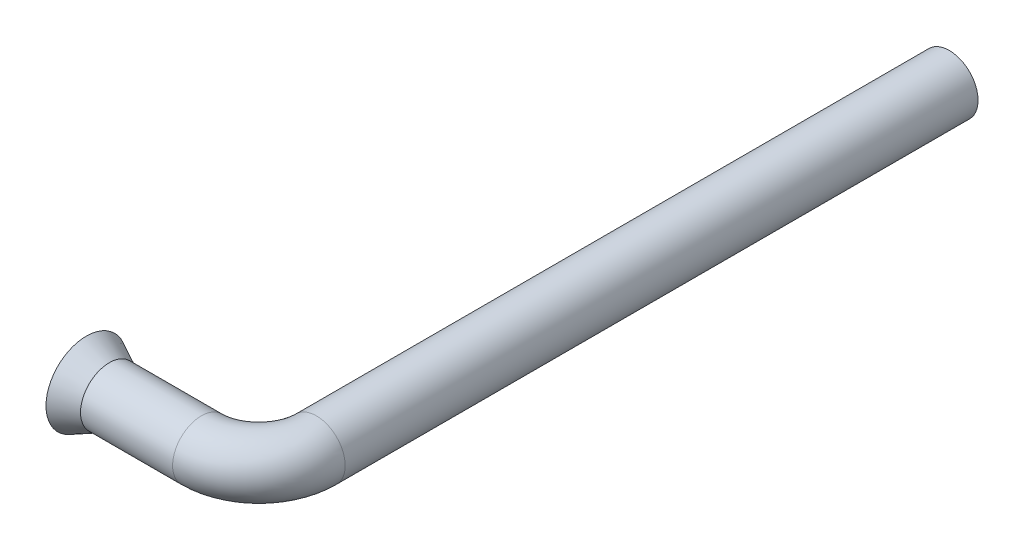
ISO-10303-21;
HEADER;
FILE_DESCRIPTION(('STEP AP214'),'2;1');
FILE_NAME('part.step','',(''),(''),'','','');
FILE_SCHEMA(('AUTOMOTIVE_DESIGN { 1 0 10303 214 1 1 1 1 }'));
ENDSEC;
DATA;
#1=APPLICATION_CONTEXT('core data for automotive mechanical design processes');
#2=APPLICATION_PROTOCOL_DEFINITION('international standard','automotive_design',2000,#1);
#3=PRODUCT_CONTEXT('',#1,'mechanical');
#4=PRODUCT('Part','Part','',(#3));
#5=PRODUCT_RELATED_PRODUCT_CATEGORY('part','',(#4));
#6=PRODUCT_DEFINITION_FORMATION('','',#4);
#7=PRODUCT_DEFINITION_CONTEXT('part definition',#1,'design');
#8=PRODUCT_DEFINITION('design','',#6,#7);
#9=PRODUCT_DEFINITION_SHAPE('','',#8);
#10=(LENGTH_UNIT() NAMED_UNIT(*) SI_UNIT(.MILLI.,.METRE.));
#11=(NAMED_UNIT(*) PLANE_ANGLE_UNIT() SI_UNIT($,.RADIAN.));
#12=(NAMED_UNIT(*) SI_UNIT($,.STERADIAN.) SOLID_ANGLE_UNIT());
#13=UNCERTAINTY_MEASURE_WITH_UNIT(LENGTH_MEASURE(1.E-05),#10,'distance_accuracy_value','');
#14=(GEOMETRIC_REPRESENTATION_CONTEXT(3) GLOBAL_UNCERTAINTY_ASSIGNED_CONTEXT((#13)) GLOBAL_UNIT_ASSIGNED_CONTEXT((#10,
#11,#12)) REPRESENTATION_CONTEXT('',''));
#15=CARTESIAN_POINT('',(0.,0.,0.));
#16=DIRECTION('',(0.,0.,1.));
#17=DIRECTION('',(1.,0.,0.));
#18=AXIS2_PLACEMENT_3D('',#15,#16,#17);
#19=CARTESIAN_POINT('',(0.,0.,0.));
#20=DIRECTION('',(1.,0.,0.));
#21=DIRECTION('',(0.,0.,-1.));
#22=AXIS2_PLACEMENT_3D('',#19,#20,#21);
#23=CYLINDRICAL_SURFACE('',#22,5.);
#24=CARTESIAN_POINT('',(19.9999999999999,0.,0.));
#25=DIRECTION('',(1.,0.,0.));
#26=DIRECTION('',(0.,0.,-1.));
#27=AXIS2_PLACEMENT_3D('',#24,#25,#26);
#28=CIRCLE('',#27,5.);
#29=CARTESIAN_POINT('',(19.9999999999999,0.,5.));
#30=VERTEX_POINT('',#29);
#31=EDGE_CURVE('E71',#30,#30,#28,.T.);
#32=ORIENTED_EDGE('',*,*,#31,.F.);
#33=EDGE_LOOP('',(#32));
#34=FACE_BOUND('',#33,.T.);
#35=CARTESIAN_POINT('',(4.,0.,0.));
#36=DIRECTION('',(-1.,0.,0.));
#37=DIRECTION('',(0.,0.,1.));
#38=AXIS2_PLACEMENT_3D('',#35,#36,#37);
#39=CIRCLE('',#38,5.);
#40=CARTESIAN_POINT('',(4.,0.,5.));
#41=VERTEX_POINT('',#40);
#42=EDGE_CURVE('E78',#41,#41,#39,.T.);
#43=ORIENTED_EDGE('',*,*,#42,.F.);
#44=EDGE_LOOP('',(#43));
#45=FACE_BOUND('',#44,.T.);
#46=ADVANCED_FACE('F34',(#34,#45),#23,.T.);
#47=CARTESIAN_POINT('',(20.,0.,-10.));
#48=DIRECTION('',(0.,1.,0.));
#49=DIRECTION('',(0.,0.,1.));
#50=AXIS2_PLACEMENT_3D('',#47,#48,#49);
#51=TOROIDAL_SURFACE('',#50,10.,5.);
#52=CARTESIAN_POINT('',(30.,0.,-10.0000000000001));
#53=DIRECTION('',(0.,0.,-1.));
#54=DIRECTION('',(-1.,0.,0.));
#55=AXIS2_PLACEMENT_3D('',#52,#53,#54);
#56=CIRCLE('',#55,5.);
#57=CARTESIAN_POINT('',(35.,0.,-10.0000000000001));
#58=VERTEX_POINT('',#57);
#59=EDGE_CURVE('E38',#58,#58,#56,.T.);
#60=CARTESIAN_POINT('',(20.,0.,-10.));
#61=DIRECTION('',(0.,1.,0.));
#62=DIRECTION('',(0.,0.,1.));
#63=AXIS2_PLACEMENT_3D('',#60,#61,#62);
#64=CIRCLE('',#63,15.);
#65=EDGE_CURVE('',#30,#58,#64,.T.);
#66=ORIENTED_EDGE('',*,*,#31,.T.);
#67=ORIENTED_EDGE('',*,*,#59,.F.);
#68=ORIENTED_EDGE('',*,*,#65,.T.);
#69=ORIENTED_EDGE('',*,*,#65,.F.);
#70=EDGE_LOOP('',(#66,#68,#67,#69));
#71=FACE_BOUND('',#70,.T.);
#72=ADVANCED_FACE('F98',(#71),#51,.T.);
#73=CARTESIAN_POINT('',(30.,0.,-10.0000000000001));
#74=DIRECTION('',(0.,0.,-1.));
#75=DIRECTION('',(-1.,0.,0.));
#76=AXIS2_PLACEMENT_3D('',#73,#74,#75);
#77=CYLINDRICAL_SURFACE('',#76,5.);
#78=CARTESIAN_POINT('',(30.,0.,-120.));
#79=DIRECTION('',(0.,0.,-1.));
#80=DIRECTION('',(-1.,0.,0.));
#81=AXIS2_PLACEMENT_3D('',#78,#79,#80);
#82=CIRCLE('',#81,5.);
#83=CARTESIAN_POINT('',(25.,0.,-120.));
#84=VERTEX_POINT('',#83);
#85=EDGE_CURVE('E49',#84,#84,#82,.T.);
#86=ORIENTED_EDGE('',*,*,#85,.F.);
#87=EDGE_LOOP('',(#86));
#88=FACE_BOUND('',#87,.T.);
#89=ORIENTED_EDGE('',*,*,#59,.T.);
#90=EDGE_LOOP('',(#89));
#91=FACE_BOUND('',#90,.T.);
#92=ADVANCED_FACE('F36',(#88,#91),#77,.T.);
#93=CARTESIAN_POINT('',(0.,0.,0.));
#94=DIRECTION('',(1.,0.,0.));
#95=DIRECTION('',(0.,0.,-1.));
#96=AXIS2_PLACEMENT_3D('',#93,#94,#95);
#97=PLANE('',#96);
#98=CARTESIAN_POINT('',(0.,0.,0.));
#99=DIRECTION('',(1.,0.,0.));
#100=DIRECTION('',(0.,0.,-1.));
#101=AXIS2_PLACEMENT_3D('',#98,#99,#100);
#102=CIRCLE('',#101,4.);
#103=CARTESIAN_POINT('',(0.,0.,-4.));
#104=VERTEX_POINT('',#103);
#105=EDGE_CURVE('E67',#104,#104,#102,.F.);
#106=ORIENTED_EDGE('',*,*,#105,.F.);
#107=EDGE_LOOP('',(#106));
#108=FACE_BOUND('',#107,.T.);
#109=CARTESIAN_POINT('',(0.,0.,0.));
#110=DIRECTION('',(-1.,0.,0.));
#111=DIRECTION('',(0.,0.,1.));
#112=AXIS2_PLACEMENT_3D('',#109,#110,#111);
#113=CIRCLE('',#112,6.99999999999997);
#114=CARTESIAN_POINT('',(0.,0.,6.99999999999997));
#115=VERTEX_POINT('',#114);
#116=EDGE_CURVE('E73',#115,#115,#113,.T.);
#117=ORIENTED_EDGE('',*,*,#116,.T.);
#118=EDGE_LOOP('',(#117));
#119=FACE_BOUND('',#118,.T.);
#120=ADVANCED_FACE('F90',(#108,#119),#97,.F.);
#121=CARTESIAN_POINT('',(30.,0.,-120.));
#122=DIRECTION('',(0.,0.,-1.));
#123=DIRECTION('',(-1.,0.,0.));
#124=AXIS2_PLACEMENT_3D('',#121,#122,#123);
#125=PLANE('',#124);
#126=CARTESIAN_POINT('',(30.,0.,-120.));
#127=DIRECTION('',(0.,0.,-1.));
#128=DIRECTION('',(-1.,0.,0.));
#129=AXIS2_PLACEMENT_3D('',#126,#127,#128);
#130=CIRCLE('',#129,4.);
#131=CARTESIAN_POINT('',(26.,0.,-120.));
#132=VERTEX_POINT('',#131);
#133=EDGE_CURVE('E11',#132,#132,#130,.F.);
#134=ORIENTED_EDGE('',*,*,#133,.T.);
#135=EDGE_LOOP('',(#134));
#136=FACE_BOUND('',#135,.T.);
#137=ORIENTED_EDGE('',*,*,#85,.T.);
#138=EDGE_LOOP('',(#137));
#139=FACE_BOUND('',#138,.T.);
#140=ADVANCED_FACE('F52',(#136,#139),#125,.T.);
#141=CARTESIAN_POINT('',(0.,0.,0.));
#142=DIRECTION('',(1.,0.,0.));
#143=DIRECTION('',(0.,0.,-1.));
#144=AXIS2_PLACEMENT_3D('',#141,#142,#143);
#145=CYLINDRICAL_SURFACE('',#144,4.);
#146=ORIENTED_EDGE('',*,*,#105,.T.);
#147=EDGE_LOOP('',(#146));
#148=FACE_BOUND('',#147,.T.);
#149=CARTESIAN_POINT('',(19.9999999999999,0.,0.));
#150=DIRECTION('',(1.,0.,0.));
#151=DIRECTION('',(0.,0.,-1.));
#152=AXIS2_PLACEMENT_3D('',#149,#150,#151);
#153=CIRCLE('',#152,4.);
#154=CARTESIAN_POINT('',(19.9999999999999,0.,4.));
#155=VERTEX_POINT('',#154);
#156=EDGE_CURVE('E64',#155,#155,#153,.F.);
#157=ORIENTED_EDGE('',*,*,#156,.F.);
#158=EDGE_LOOP('',(#157));
#159=FACE_BOUND('',#158,.T.);
#160=ADVANCED_FACE('F87',(#148,#159),#145,.F.);
#161=CARTESIAN_POINT('',(20.,0.,-10.));
#162=DIRECTION('',(0.,1.,0.));
#163=DIRECTION('',(0.,0.,1.));
#164=AXIS2_PLACEMENT_3D('',#161,#162,#163);
#165=TOROIDAL_SURFACE('',#164,10.,4.);
#166=CARTESIAN_POINT('',(30.,0.,-10.0000000000001));
#167=DIRECTION('',(0.,0.,-1.));
#168=DIRECTION('',(-1.,0.,0.));
#169=AXIS2_PLACEMENT_3D('',#166,#167,#168);
#170=CIRCLE('',#169,4.);
#171=CARTESIAN_POINT('',(34.,0.,-10.0000000000001));
#172=VERTEX_POINT('',#171);
#173=EDGE_CURVE('E43',#172,#172,#170,.F.);
#174=CARTESIAN_POINT('',(20.,0.,-10.));
#175=DIRECTION('',(0.,1.,0.));
#176=DIRECTION('',(0.,0.,1.));
#177=AXIS2_PLACEMENT_3D('',#174,#175,#176);
#178=CIRCLE('',#177,14.);
#179=EDGE_CURVE('',#155,#172,#178,.T.);
#180=ORIENTED_EDGE('',*,*,#156,.T.);
#181=ORIENTED_EDGE('',*,*,#173,.F.);
#182=ORIENTED_EDGE('',*,*,#179,.T.);
#183=ORIENTED_EDGE('',*,*,#179,.F.);
#184=EDGE_LOOP('',(#180,#182,#181,#183));
#185=FACE_BOUND('',#184,.T.);
#186=ADVANCED_FACE('F59',(#185),#165,.F.);
#187=CARTESIAN_POINT('',(30.,0.,-10.0000000000001));
#188=DIRECTION('',(0.,0.,-1.));
#189=DIRECTION('',(-1.,0.,0.));
#190=AXIS2_PLACEMENT_3D('',#187,#188,#189);
#191=CYLINDRICAL_SURFACE('',#190,4.);
#192=ORIENTED_EDGE('',*,*,#133,.F.);
#193=EDGE_LOOP('',(#192));
#194=FACE_BOUND('',#193,.T.);
#195=ORIENTED_EDGE('',*,*,#173,.T.);
#196=EDGE_LOOP('',(#195));
#197=FACE_BOUND('',#196,.T.);
#198=ADVANCED_FACE('F55',(#194,#197),#191,.F.);
#199=CARTESIAN_POINT('',(4.,0.,0.));
#200=DIRECTION('',(-1.,0.,0.));
#201=DIRECTION('',(0.,0.,1.));
#202=AXIS2_PLACEMENT_3D('',#199,#200,#201);
#203=CONICAL_SURFACE('',#202,5.,0.463647609000799);
#204=ORIENTED_EDGE('',*,*,#116,.F.);
#205=EDGE_LOOP('',(#204));
#206=FACE_BOUND('',#205,.T.);
#207=ORIENTED_EDGE('',*,*,#42,.T.);
#208=EDGE_LOOP('',(#207));
#209=FACE_BOUND('',#208,.T.);
#210=ADVANCED_FACE('F58',(#206,#209),#203,.T.);
#211=CLOSED_SHELL('',(#46,#72,#92,#120,#140,#160,#186,#198,#210));
#212=MANIFOLD_SOLID_BREP('B2',#211);
#213=ADVANCED_BREP_SHAPE_REPRESENTATION('',(#18,#212),#14);
#214=SHAPE_DEFINITION_REPRESENTATION(#9,#213);
ENDSEC;
END-ISO-10303-21;
